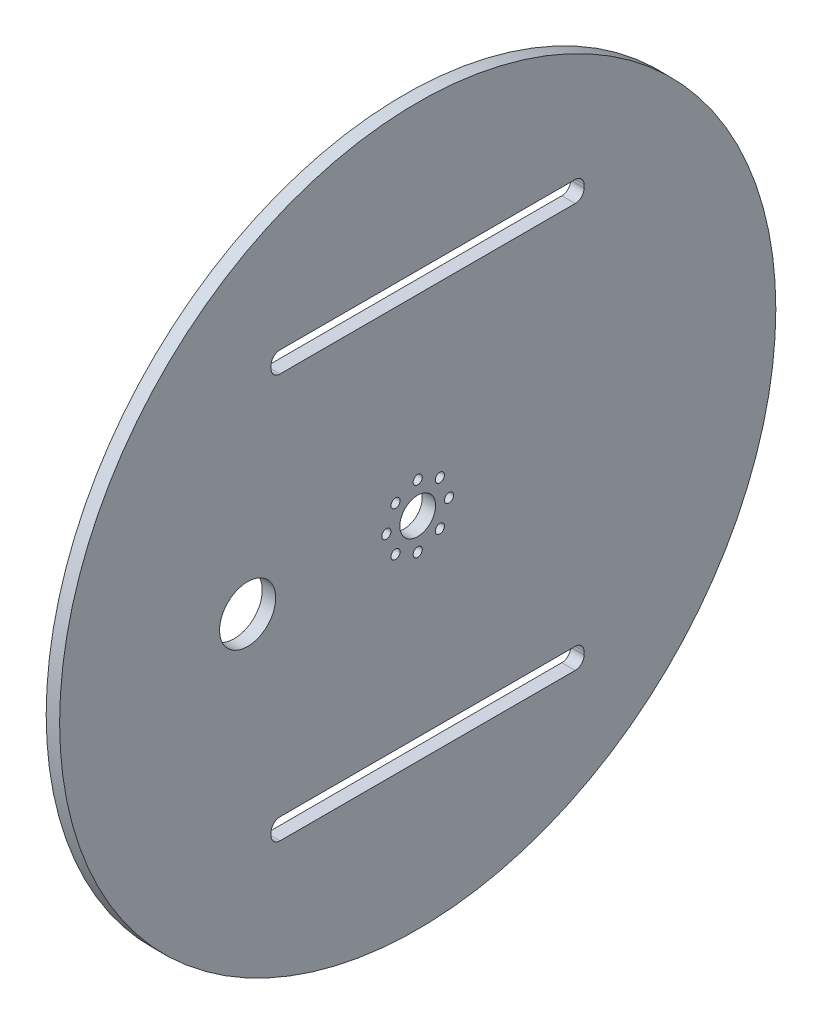
ISO-10303-21;
HEADER;
FILE_DESCRIPTION(('STEP AP214'),'2;1');
FILE_NAME('part.step','',(''),(''),'','','');
FILE_SCHEMA(('AUTOMOTIVE_DESIGN { 1 0 10303 214 1 1 1 1 }'));
ENDSEC;
DATA;
#1=APPLICATION_CONTEXT('core data for automotive mechanical design processes');
#2=APPLICATION_PROTOCOL_DEFINITION('international standard','automotive_design',2000,#1);
#3=PRODUCT_CONTEXT('',#1,'mechanical');
#4=PRODUCT('Part','Part','',(#3));
#5=PRODUCT_RELATED_PRODUCT_CATEGORY('part','',(#4));
#6=PRODUCT_DEFINITION_FORMATION('','',#4);
#7=PRODUCT_DEFINITION_CONTEXT('part definition',#1,'design');
#8=PRODUCT_DEFINITION('design','',#6,#7);
#9=PRODUCT_DEFINITION_SHAPE('','',#8);
#10=(LENGTH_UNIT() NAMED_UNIT(*) SI_UNIT(.MILLI.,.METRE.));
#11=(NAMED_UNIT(*) PLANE_ANGLE_UNIT() SI_UNIT($,.RADIAN.));
#12=(NAMED_UNIT(*) SI_UNIT($,.STERADIAN.) SOLID_ANGLE_UNIT());
#13=UNCERTAINTY_MEASURE_WITH_UNIT(LENGTH_MEASURE(1.E-05),#10,'distance_accuracy_value','');
#14=(GEOMETRIC_REPRESENTATION_CONTEXT(3) GLOBAL_UNCERTAINTY_ASSIGNED_CONTEXT((#13)) GLOBAL_UNIT_ASSIGNED_CONTEXT((#10,
#11,#12)) REPRESENTATION_CONTEXT('',''));
#15=CARTESIAN_POINT('',(0.,0.,0.));
#16=DIRECTION('',(0.,0.,1.));
#17=DIRECTION('',(1.,0.,0.));
#18=AXIS2_PLACEMENT_3D('',#15,#16,#17);
#19=CARTESIAN_POINT('',(3.,0.,0.));
#20=DIRECTION('',(1.,0.,0.));
#21=DIRECTION('',(0.,0.,-1.));
#22=AXIS2_PLACEMENT_3D('',#19,#20,#21);
#23=PLANE('',#22);
#24=CARTESIAN_POINT('',(3.,6.99999999999923,8.88178419700125E-13));
#25=DIRECTION('',(1.,0.,0.));
#26=DIRECTION('',(0.,0.,-1.));
#27=AXIS2_PLACEMENT_3D('',#24,#25,#26);
#28=CIRCLE('',#27,1.02000000000003);
#29=CARTESIAN_POINT('',(3.,6.99999999999923,-1.01999999999914));
#30=VERTEX_POINT('',#29);
#31=EDGE_CURVE('E219',#30,#30,#28,.T.);
#32=ORIENTED_EDGE('',*,*,#31,.F.);
#33=EDGE_LOOP('',(#32));
#34=FACE_BOUND('',#33,.T.);
#35=CARTESIAN_POINT('',(3.,-6.66133814775094E-13,6.99999999999923));
#36=DIRECTION('',(1.,0.,0.));
#37=DIRECTION('',(0.,0.,-1.));
#38=AXIS2_PLACEMENT_3D('',#35,#36,#37);
#39=CIRCLE('',#38,1.02000000000003);
#40=CARTESIAN_POINT('',(3.,-6.66133814775094E-13,5.9799999999992));
#41=VERTEX_POINT('',#40);
#42=EDGE_CURVE('E231',#41,#41,#39,.T.);
#43=ORIENTED_EDGE('',*,*,#42,.F.);
#44=EDGE_LOOP('',(#43));
#45=FACE_BOUND('',#44,.T.);
#46=CARTESIAN_POINT('',(3.,-6.99999999999923,-4.44089209850063E-13));
#47=DIRECTION('',(1.,0.,0.));
#48=DIRECTION('',(0.,0.,-1.));
#49=AXIS2_PLACEMENT_3D('',#46,#47,#48);
#50=CIRCLE('',#49,1.02000000000003);
#51=CARTESIAN_POINT('',(3.,-6.99999999999923,-1.02000000000047));
#52=VERTEX_POINT('',#51);
#53=EDGE_CURVE('E243',#52,#52,#50,.T.);
#54=ORIENTED_EDGE('',*,*,#53,.F.);
#55=EDGE_LOOP('',(#54));
#56=FACE_BOUND('',#55,.T.);
#57=DIRECTION('',(0.,0.,-1.));
#58=VECTOR('',#57,1.);
#59=CARTESIAN_POINT('',(3.,42.8370574368007,30.755353243443));
#60=LINE('',#59,#58);
#61=CARTESIAN_POINT('',(3.,42.8370574368007,30.755353243443));
#62=VERTEX_POINT('',#61);
#63=CARTESIAN_POINT('',(3.,42.8370574368008,-35.1750055721376));
#64=VERTEX_POINT('',#63);
#65=EDGE_CURVE('E257',#62,#64,#60,.T.);
#66=ORIENTED_EDGE('',*,*,#65,.F.);
#67=CARTESIAN_POINT('',(3.,44.8370574368007,30.7553532434435));
#68=DIRECTION('',(1.,0.,0.));
#69=DIRECTION('',(0.,0.,-1.));
#70=AXIS2_PLACEMENT_3D('',#67,#68,#69);
#71=CIRCLE('',#70,1.99999999999989);
#72=CARTESIAN_POINT('',(3.,44.8370574368007,32.7553532434433));
#73=VERTEX_POINT('',#72);
#74=EDGE_CURVE('E255',#73,#62,#71,.T.);
#75=ORIENTED_EDGE('',*,*,#74,.F.);
#76=DIRECTION('',(0.,-1.,0.));
#77=VECTOR('',#76,1.);
#78=CARTESIAN_POINT('',(3.,44.8370574368007,32.7553532434433));
#79=LINE('',#78,#77);
#80=CARTESIAN_POINT('',(3.,45.4890770146612,32.7553532434433));
#81=VERTEX_POINT('',#80);
#82=EDGE_CURVE('E271',#81,#73,#79,.T.);
#83=ORIENTED_EDGE('',*,*,#82,.F.);
#84=CARTESIAN_POINT('',(3.,45.4890770146612,30.7553532434435));
#85=DIRECTION('',(1.,0.,0.));
#86=DIRECTION('',(0.,0.,-1.));
#87=AXIS2_PLACEMENT_3D('',#84,#85,#86);
#88=CIRCLE('',#87,1.99999999999989);
#89=CARTESIAN_POINT('',(3.,47.4890770146611,30.755353243443));
#90=VERTEX_POINT('',#89);
#91=EDGE_CURVE('E268',#90,#81,#88,.T.);
#92=ORIENTED_EDGE('',*,*,#91,.F.);
#93=DIRECTION('',(0.,0.,1.));
#94=VECTOR('',#93,1.);
#95=CARTESIAN_POINT('',(3.,47.4890770146612,30.755353243443));
#96=LINE('',#95,#94);
#97=CARTESIAN_POINT('',(3.,47.4890770146612,-35.1750055721376));
#98=VERTEX_POINT('',#97);
#99=EDGE_CURVE('E266',#98,#90,#96,.T.);
#100=ORIENTED_EDGE('',*,*,#99,.F.);
#101=CARTESIAN_POINT('',(3.,45.4890770146612,-35.175005572138));
#102=DIRECTION('',(1.,0.,0.));
#103=DIRECTION('',(0.,0.,1.));
#104=AXIS2_PLACEMENT_3D('',#101,#102,#103);
#105=CIRCLE('',#104,1.99999999999989);
#106=CARTESIAN_POINT('',(3.,45.4890770146612,-37.1750055721379));
#107=VERTEX_POINT('',#106);
#108=EDGE_CURVE('E264',#107,#98,#105,.T.);
#109=ORIENTED_EDGE('',*,*,#108,.F.);
#110=DIRECTION('',(0.,1.,0.));
#111=VECTOR('',#110,1.);
#112=CARTESIAN_POINT('',(3.,45.4890770146612,-37.1750055721378));
#113=LINE('',#112,#111);
#114=CARTESIAN_POINT('',(3.,44.8370574368007,-37.1750055721378));
#115=VERTEX_POINT('',#114);
#116=EDGE_CURVE('E262',#115,#107,#113,.T.);
#117=ORIENTED_EDGE('',*,*,#116,.F.);
#118=CARTESIAN_POINT('',(3.,44.8370574368007,-35.175005572138));
#119=DIRECTION('',(1.,0.,0.));
#120=DIRECTION('',(0.,0.,1.));
#121=AXIS2_PLACEMENT_3D('',#118,#119,#120);
#122=CIRCLE('',#121,1.99999999999989);
#123=EDGE_CURVE('E260',#64,#115,#122,.T.);
#124=ORIENTED_EDGE('',*,*,#123,.F.);
#125=EDGE_LOOP('',(#66,#75,#83,#92,#100,#109,#117,#124));
#126=FACE_BOUND('',#125,.T.);
#127=CARTESIAN_POINT('',(3.,6.66133814775094E-13,-6.99999999999923));
#128=DIRECTION('',(1.,0.,0.));
#129=DIRECTION('',(0.,0.,-1.));
#130=AXIS2_PLACEMENT_3D('',#127,#128,#129);
#131=CIRCLE('',#130,1.02000000000003);
#132=CARTESIAN_POINT('',(3.,6.66133814775094E-13,-8.01999999999926));
#133=VERTEX_POINT('',#132);
#134=EDGE_CURVE('E314',#133,#133,#131,.T.);
#135=ORIENTED_EDGE('',*,*,#134,.F.);
#136=EDGE_LOOP('',(#135));
#137=FACE_BOUND('',#136,.T.);
#138=CARTESIAN_POINT('',(3.,0.,0.));
#139=DIRECTION('',(1.,0.,0.));
#140=DIRECTION('',(0.,0.,-1.));
#141=AXIS2_PLACEMENT_3D('',#138,#139,#140);
#142=CIRCLE('',#141,4.00000000000021);
#143=CARTESIAN_POINT('',(3.,0.,-4.00000000000021));
#144=VERTEX_POINT('',#143);
#145=EDGE_CURVE('E326',#144,#144,#142,.T.);
#146=ORIENTED_EDGE('',*,*,#145,.F.);
#147=EDGE_LOOP('',(#146));
#148=FACE_BOUND('',#147,.T.);
#149=CARTESIAN_POINT('',(3.,0.,0.));
#150=DIRECTION('',(1.,0.,0.));
#151=DIRECTION('',(0.,0.,-1.));
#152=AXIS2_PLACEMENT_3D('',#149,#150,#151);
#153=CIRCLE('',#152,79.9999999999999);
#154=CARTESIAN_POINT('',(3.,0.,-79.9999999999999));
#155=VERTEX_POINT('',#154);
#156=EDGE_CURVE('E11',#155,#155,#153,.T.);
#157=ORIENTED_EDGE('',*,*,#156,.T.);
#158=EDGE_LOOP('',(#157));
#159=FACE_BOUND('',#158,.T.);
#160=CARTESIAN_POINT('',(3.,4.94974746830579,-4.9497474683049));
#161=DIRECTION('',(1.,0.,0.));
#162=DIRECTION('',(0.,0.,-1.));
#163=AXIS2_PLACEMENT_3D('',#160,#161,#162);
#164=CIRCLE('',#163,1.02000000000003);
#165=CARTESIAN_POINT('',(3.,4.94974746830579,-5.96974746830493));
#166=VERTEX_POINT('',#165);
#167=EDGE_CURVE('E320',#166,#166,#164,.T.);
#168=ORIENTED_EDGE('',*,*,#167,.F.);
#169=EDGE_LOOP('',(#168));
#170=FACE_BOUND('',#169,.T.);
#171=CARTESIAN_POINT('',(3.,-4.9497474683049,-4.94974746830579));
#172=DIRECTION('',(1.,0.,0.));
#173=DIRECTION('',(0.,0.,-1.));
#174=AXIS2_PLACEMENT_3D('',#171,#172,#173);
#175=CIRCLE('',#174,1.02000000000003);
#176=CARTESIAN_POINT('',(3.,-4.9497474683049,-5.96974746830582));
#177=VERTEX_POINT('',#176);
#178=EDGE_CURVE('E249',#177,#177,#175,.T.);
#179=ORIENTED_EDGE('',*,*,#178,.F.);
#180=EDGE_LOOP('',(#179));
#181=FACE_BOUND('',#180,.T.);
#182=CARTESIAN_POINT('',(3.,-4.94974746830579,4.9497474683049));
#183=DIRECTION('',(1.,0.,0.));
#184=DIRECTION('',(0.,0.,-1.));
#185=AXIS2_PLACEMENT_3D('',#182,#183,#184);
#186=CIRCLE('',#185,1.02000000000003);
#187=CARTESIAN_POINT('',(3.,-4.94974746830579,3.92974746830487));
#188=VERTEX_POINT('',#187);
#189=EDGE_CURVE('E237',#188,#188,#186,.T.);
#190=ORIENTED_EDGE('',*,*,#189,.F.);
#191=EDGE_LOOP('',(#190));
#192=FACE_BOUND('',#191,.T.);
#193=CARTESIAN_POINT('',(3.,4.9497474683049,4.94974746830579));
#194=DIRECTION('',(1.,0.,0.));
#195=DIRECTION('',(0.,0.,-1.));
#196=AXIS2_PLACEMENT_3D('',#193,#194,#195);
#197=CIRCLE('',#196,1.02000000000003);
#198=CARTESIAN_POINT('',(3.,4.9497474683049,3.92974746830576));
#199=VERTEX_POINT('',#198);
#200=EDGE_CURVE('E225',#199,#199,#197,.T.);
#201=ORIENTED_EDGE('',*,*,#200,.F.);
#202=EDGE_LOOP('',(#201));
#203=FACE_BOUND('',#202,.T.);
#204=CARTESIAN_POINT('',(3.,0.,38.0000000000003));
#205=DIRECTION('',(1.,0.,0.));
#206=DIRECTION('',(0.,0.,-1.));
#207=AXIS2_PLACEMENT_3D('',#204,#205,#206);
#208=CIRCLE('',#207,6.26995214826618);
#209=CARTESIAN_POINT('',(3.,0.,31.7300478517341));
#210=VERTEX_POINT('',#209);
#211=EDGE_CURVE('E213',#210,#210,#208,.T.);
#212=ORIENTED_EDGE('',*,*,#211,.F.);
#213=EDGE_LOOP('',(#212));
#214=FACE_BOUND('',#213,.T.);
#215=DIRECTION('',(0.,0.,-1.));
#216=VECTOR('',#215,1.);
#217=CARTESIAN_POINT('',(3.,-47.4890770146612,30.755353243443));
#218=LINE('',#217,#216);
#219=CARTESIAN_POINT('',(3.,-47.4890770146612,30.755353243443));
#220=VERTEX_POINT('',#219);
#221=CARTESIAN_POINT('',(3.,-47.4890770146612,-35.1750055721376));
#222=VERTEX_POINT('',#221);
#223=EDGE_CURVE('E156',#220,#222,#218,.T.);
#224=ORIENTED_EDGE('',*,*,#223,.F.);
#225=CARTESIAN_POINT('',(3.,-45.4890770146612,30.7553532434435));
#226=DIRECTION('',(1.,0.,0.));
#227=DIRECTION('',(0.,0.,1.));
#228=AXIS2_PLACEMENT_3D('',#225,#226,#227);
#229=CIRCLE('',#228,1.99999999999989);
#230=CARTESIAN_POINT('',(3.,-45.4890770146612,32.7553532434433));
#231=VERTEX_POINT('',#230);
#232=EDGE_CURVE('E148',#231,#220,#229,.T.);
#233=ORIENTED_EDGE('',*,*,#232,.F.);
#234=DIRECTION('',(0.,-1.,0.));
#235=VECTOR('',#234,1.);
#236=CARTESIAN_POINT('',(3.,-44.8370574368007,32.7553532434433));
#237=LINE('',#236,#235);
#238=CARTESIAN_POINT('',(3.,-44.8370574368007,32.7553532434433));
#239=VERTEX_POINT('',#238);
#240=EDGE_CURVE('E181',#239,#231,#237,.T.);
#241=ORIENTED_EDGE('',*,*,#240,.F.);
#242=CARTESIAN_POINT('',(3.,-44.8370574368007,30.7553532434435));
#243=DIRECTION('',(1.,0.,0.));
#244=DIRECTION('',(0.,0.,1.));
#245=AXIS2_PLACEMENT_3D('',#242,#243,#244);
#246=CIRCLE('',#245,1.99999999999989);
#247=CARTESIAN_POINT('',(3.,-42.8370574368007,30.755353243443));
#248=VERTEX_POINT('',#247);
#249=EDGE_CURVE('E179',#248,#239,#246,.T.);
#250=ORIENTED_EDGE('',*,*,#249,.F.);
#251=DIRECTION('',(0.,0.,1.));
#252=VECTOR('',#251,1.);
#253=CARTESIAN_POINT('',(3.,-42.8370574368007,30.755353243443));
#254=LINE('',#253,#252);
#255=CARTESIAN_POINT('',(3.,-42.8370574368008,-35.1750055721376));
#256=VERTEX_POINT('',#255);
#257=EDGE_CURVE('E177',#256,#248,#254,.T.);
#258=ORIENTED_EDGE('',*,*,#257,.F.);
#259=CARTESIAN_POINT('',(3.,-44.8370574368007,-35.175005572138));
#260=DIRECTION('',(1.,0.,0.));
#261=DIRECTION('',(0.,0.,-1.));
#262=AXIS2_PLACEMENT_3D('',#259,#260,#261);
#263=CIRCLE('',#262,1.99999999999989);
#264=CARTESIAN_POINT('',(3.,-44.8370574368007,-37.1750055721378));
#265=VERTEX_POINT('',#264);
#266=EDGE_CURVE('E175',#265,#256,#263,.T.);
#267=ORIENTED_EDGE('',*,*,#266,.F.);
#268=DIRECTION('',(0.,1.,0.));
#269=VECTOR('',#268,1.);
#270=CARTESIAN_POINT('',(3.,-45.4890770146612,-37.1750055721378));
#271=LINE('',#270,#269);
#272=CARTESIAN_POINT('',(3.,-45.4890770146612,-37.1750055721379));
#273=VERTEX_POINT('',#272);
#274=EDGE_CURVE('E171',#273,#265,#271,.T.);
#275=ORIENTED_EDGE('',*,*,#274,.F.);
#276=CARTESIAN_POINT('',(3.,-45.4890770146612,-35.175005572138));
#277=DIRECTION('',(1.,0.,0.));
#278=DIRECTION('',(0.,0.,-1.));
#279=AXIS2_PLACEMENT_3D('',#276,#277,#278);
#280=CIRCLE('',#279,1.99999999999989);
#281=EDGE_CURVE('E169',#222,#273,#280,.T.);
#282=ORIENTED_EDGE('',*,*,#281,.F.);
#283=EDGE_LOOP('',(#224,#233,#241,#250,#258,#267,#275,#282));
#284=FACE_BOUND('',#283,.T.);
#285=ADVANCED_FACE('F35',(#34,#45,#56,#126,#137,#148,#159,#170,#181,#192,#203,#214,#284),#23,.T.);
#286=CARTESIAN_POINT('',(0.,0.,0.));
#287=DIRECTION('',(1.,0.,0.));
#288=DIRECTION('',(0.,0.,-1.));
#289=AXIS2_PLACEMENT_3D('',#286,#287,#288);
#290=PLANE('',#289);
#291=CARTESIAN_POINT('',(0.,0.,38.0000000000003));
#292=DIRECTION('',(1.,0.,0.));
#293=DIRECTION('',(0.,0.,-1.));
#294=AXIS2_PLACEMENT_3D('',#291,#292,#293);
#295=CIRCLE('',#294,6.26995214826618);
#296=CARTESIAN_POINT('',(0.,0.,31.7300478517341));
#297=VERTEX_POINT('',#296);
#298=EDGE_CURVE('E164',#297,#297,#295,.T.);
#299=ORIENTED_EDGE('',*,*,#298,.T.);
#300=EDGE_LOOP('',(#299));
#301=FACE_BOUND('',#300,.T.);
#302=CARTESIAN_POINT('',(0.,6.99999999999923,8.88178419700125E-13));
#303=DIRECTION('',(1.,0.,0.));
#304=DIRECTION('',(0.,0.,-1.));
#305=AXIS2_PLACEMENT_3D('',#302,#303,#304);
#306=CIRCLE('',#305,1.02000000000003);
#307=CARTESIAN_POINT('',(0.,6.99999999999923,-1.01999999999914));
#308=VERTEX_POINT('',#307);
#309=EDGE_CURVE('E216',#308,#308,#306,.T.);
#310=ORIENTED_EDGE('',*,*,#309,.T.);
#311=EDGE_LOOP('',(#310));
#312=FACE_BOUND('',#311,.T.);
#313=CARTESIAN_POINT('',(0.,4.9497474683049,4.94974746830579));
#314=DIRECTION('',(1.,0.,0.));
#315=DIRECTION('',(0.,0.,-1.));
#316=AXIS2_PLACEMENT_3D('',#313,#314,#315);
#317=CIRCLE('',#316,1.02000000000003);
#318=CARTESIAN_POINT('',(0.,4.9497474683049,3.92974746830576));
#319=VERTEX_POINT('',#318);
#320=EDGE_CURVE('E222',#319,#319,#317,.T.);
#321=ORIENTED_EDGE('',*,*,#320,.T.);
#322=EDGE_LOOP('',(#321));
#323=FACE_BOUND('',#322,.T.);
#324=CARTESIAN_POINT('',(0.,-6.66133814775094E-13,6.99999999999923));
#325=DIRECTION('',(1.,0.,0.));
#326=DIRECTION('',(0.,0.,-1.));
#327=AXIS2_PLACEMENT_3D('',#324,#325,#326);
#328=CIRCLE('',#327,1.02000000000003);
#329=CARTESIAN_POINT('',(0.,-6.66133814775094E-13,5.9799999999992));
#330=VERTEX_POINT('',#329);
#331=EDGE_CURVE('E228',#330,#330,#328,.T.);
#332=ORIENTED_EDGE('',*,*,#331,.T.);
#333=EDGE_LOOP('',(#332));
#334=FACE_BOUND('',#333,.T.);
#335=CARTESIAN_POINT('',(0.,-4.94974746830579,4.9497474683049));
#336=DIRECTION('',(1.,0.,0.));
#337=DIRECTION('',(0.,0.,-1.));
#338=AXIS2_PLACEMENT_3D('',#335,#336,#337);
#339=CIRCLE('',#338,1.02000000000003);
#340=CARTESIAN_POINT('',(0.,-4.94974746830579,3.92974746830487));
#341=VERTEX_POINT('',#340);
#342=EDGE_CURVE('E234',#341,#341,#339,.T.);
#343=ORIENTED_EDGE('',*,*,#342,.T.);
#344=EDGE_LOOP('',(#343));
#345=FACE_BOUND('',#344,.T.);
#346=CARTESIAN_POINT('',(0.,-6.99999999999923,-4.44089209850063E-13));
#347=DIRECTION('',(1.,0.,0.));
#348=DIRECTION('',(0.,0.,-1.));
#349=AXIS2_PLACEMENT_3D('',#346,#347,#348);
#350=CIRCLE('',#349,1.02000000000003);
#351=CARTESIAN_POINT('',(0.,-6.99999999999923,-1.02000000000047));
#352=VERTEX_POINT('',#351);
#353=EDGE_CURVE('E240',#352,#352,#350,.T.);
#354=ORIENTED_EDGE('',*,*,#353,.T.);
#355=EDGE_LOOP('',(#354));
#356=FACE_BOUND('',#355,.T.);
#357=CARTESIAN_POINT('',(0.,-4.9497474683049,-4.94974746830579));
#358=DIRECTION('',(1.,0.,0.));
#359=DIRECTION('',(0.,0.,-1.));
#360=AXIS2_PLACEMENT_3D('',#357,#358,#359);
#361=CIRCLE('',#360,1.02000000000003);
#362=CARTESIAN_POINT('',(0.,-4.9497474683049,-5.96974746830582));
#363=VERTEX_POINT('',#362);
#364=EDGE_CURVE('E246',#363,#363,#361,.T.);
#365=ORIENTED_EDGE('',*,*,#364,.T.);
#366=EDGE_LOOP('',(#365));
#367=FACE_BOUND('',#366,.T.);
#368=CARTESIAN_POINT('',(0.,44.8370574368007,30.7553532434435));
#369=DIRECTION('',(1.,0.,0.));
#370=DIRECTION('',(0.,0.,-1.));
#371=AXIS2_PLACEMENT_3D('',#368,#369,#370);
#372=CIRCLE('',#371,1.99999999999989);
#373=CARTESIAN_POINT('',(0.,44.8370574368007,32.7553532434433));
#374=VERTEX_POINT('',#373);
#375=CARTESIAN_POINT('',(0.,42.8370574368007,30.755353243443));
#376=VERTEX_POINT('',#375);
#377=EDGE_CURVE('E252',#374,#376,#372,.T.);
#378=ORIENTED_EDGE('',*,*,#377,.T.);
#379=DIRECTION('',(0.,0.,-1.));
#380=VECTOR('',#379,1.);
#381=CARTESIAN_POINT('',(0.,42.8370574368007,30.755353243443));
#382=LINE('',#381,#380);
#383=CARTESIAN_POINT('',(0.,42.8370574368008,-35.1750055721376));
#384=VERTEX_POINT('',#383);
#385=EDGE_CURVE('E276',#376,#384,#382,.T.);
#386=ORIENTED_EDGE('',*,*,#385,.T.);
#387=CARTESIAN_POINT('',(0.,44.8370574368007,-35.175005572138));
#388=DIRECTION('',(1.,0.,0.));
#389=DIRECTION('',(0.,0.,1.));
#390=AXIS2_PLACEMENT_3D('',#387,#388,#389);
#391=CIRCLE('',#390,1.99999999999989);
#392=CARTESIAN_POINT('',(0.,44.8370574368007,-37.1750055721378));
#393=VERTEX_POINT('',#392);
#394=EDGE_CURVE('E279',#384,#393,#391,.T.);
#395=ORIENTED_EDGE('',*,*,#394,.T.);
#396=DIRECTION('',(0.,1.,0.));
#397=VECTOR('',#396,1.);
#398=CARTESIAN_POINT('',(0.,45.4890770146612,-37.1750055721378));
#399=LINE('',#398,#397);
#400=CARTESIAN_POINT('',(0.,45.4890770146612,-37.1750055721379));
#401=VERTEX_POINT('',#400);
#402=EDGE_CURVE('E282',#393,#401,#399,.T.);
#403=ORIENTED_EDGE('',*,*,#402,.T.);
#404=CARTESIAN_POINT('',(0.,45.4890770146612,-35.175005572138));
#405=DIRECTION('',(1.,0.,0.));
#406=DIRECTION('',(0.,0.,1.));
#407=AXIS2_PLACEMENT_3D('',#404,#405,#406);
#408=CIRCLE('',#407,1.99999999999989);
#409=CARTESIAN_POINT('',(0.,47.4890770146612,-35.1750055721376));
#410=VERTEX_POINT('',#409);
#411=EDGE_CURVE('E285',#401,#410,#408,.T.);
#412=ORIENTED_EDGE('',*,*,#411,.T.);
#413=DIRECTION('',(0.,0.,1.));
#414=VECTOR('',#413,1.);
#415=CARTESIAN_POINT('',(0.,47.4890770146612,30.755353243443));
#416=LINE('',#415,#414);
#417=CARTESIAN_POINT('',(0.,47.4890770146611,30.755353243443));
#418=VERTEX_POINT('',#417);
#419=EDGE_CURVE('E288',#410,#418,#416,.T.);
#420=ORIENTED_EDGE('',*,*,#419,.T.);
#421=CARTESIAN_POINT('',(0.,45.4890770146612,30.7553532434435));
#422=DIRECTION('',(1.,0.,0.));
#423=DIRECTION('',(0.,0.,-1.));
#424=AXIS2_PLACEMENT_3D('',#421,#422,#423);
#425=CIRCLE('',#424,1.99999999999989);
#426=CARTESIAN_POINT('',(0.,45.4890770146612,32.7553532434433));
#427=VERTEX_POINT('',#426);
#428=EDGE_CURVE('E291',#418,#427,#425,.T.);
#429=ORIENTED_EDGE('',*,*,#428,.T.);
#430=DIRECTION('',(0.,-1.,0.));
#431=VECTOR('',#430,1.);
#432=CARTESIAN_POINT('',(0.,44.8370574368007,32.7553532434433));
#433=LINE('',#432,#431);
#434=EDGE_CURVE('E258',#427,#374,#433,.T.);
#435=ORIENTED_EDGE('',*,*,#434,.T.);
#436=EDGE_LOOP('',(#378,#386,#395,#403,#412,#420,#429,#435));
#437=FACE_BOUND('',#436,.T.);
#438=CARTESIAN_POINT('',(0.,0.,0.));
#439=DIRECTION('',(1.,0.,0.));
#440=DIRECTION('',(0.,0.,-1.));
#441=AXIS2_PLACEMENT_3D('',#438,#439,#440);
#442=CIRCLE('',#441,79.9999999999999);
#443=CARTESIAN_POINT('',(0.,0.,-79.9999999999999));
#444=VERTEX_POINT('',#443);
#445=EDGE_CURVE('E39',#444,#444,#442,.T.);
#446=ORIENTED_EDGE('',*,*,#445,.F.);
#447=EDGE_LOOP('',(#446));
#448=FACE_BOUND('',#447,.T.);
#449=CARTESIAN_POINT('',(0.,0.,0.));
#450=DIRECTION('',(1.,0.,0.));
#451=DIRECTION('',(0.,0.,-1.));
#452=AXIS2_PLACEMENT_3D('',#449,#450,#451);
#453=CIRCLE('',#452,4.00000000000021);
#454=CARTESIAN_POINT('',(0.,0.,-4.00000000000021));
#455=VERTEX_POINT('',#454);
#456=EDGE_CURVE('E323',#455,#455,#453,.T.);
#457=ORIENTED_EDGE('',*,*,#456,.T.);
#458=EDGE_LOOP('',(#457));
#459=FACE_BOUND('',#458,.T.);
#460=CARTESIAN_POINT('',(0.,4.94974746830579,-4.9497474683049));
#461=DIRECTION('',(1.,0.,0.));
#462=DIRECTION('',(0.,0.,-1.));
#463=AXIS2_PLACEMENT_3D('',#460,#461,#462);
#464=CIRCLE('',#463,1.02000000000003);
#465=CARTESIAN_POINT('',(0.,4.94974746830579,-5.96974746830493));
#466=VERTEX_POINT('',#465);
#467=EDGE_CURVE('E317',#466,#466,#464,.T.);
#468=ORIENTED_EDGE('',*,*,#467,.T.);
#469=EDGE_LOOP('',(#468));
#470=FACE_BOUND('',#469,.T.);
#471=CARTESIAN_POINT('',(0.,6.66133814775094E-13,-6.99999999999923));
#472=DIRECTION('',(1.,0.,0.));
#473=DIRECTION('',(0.,0.,-1.));
#474=AXIS2_PLACEMENT_3D('',#471,#472,#473);
#475=CIRCLE('',#474,1.02000000000003);
#476=CARTESIAN_POINT('',(0.,6.66133814775094E-13,-8.01999999999926));
#477=VERTEX_POINT('',#476);
#478=EDGE_CURVE('E313',#477,#477,#475,.T.);
#479=ORIENTED_EDGE('',*,*,#478,.T.);
#480=EDGE_LOOP('',(#479));
#481=FACE_BOUND('',#480,.T.);
#482=CARTESIAN_POINT('',(0.,-45.4890770146612,30.7553532434435));
#483=DIRECTION('',(1.,0.,0.));
#484=DIRECTION('',(0.,0.,1.));
#485=AXIS2_PLACEMENT_3D('',#482,#483,#484);
#486=CIRCLE('',#485,1.99999999999989);
#487=CARTESIAN_POINT('',(0.,-45.4890770146612,32.7553532434433));
#488=VERTEX_POINT('',#487);
#489=CARTESIAN_POINT('',(0.,-47.4890770146612,30.755353243443));
#490=VERTEX_POINT('',#489);
#491=EDGE_CURVE('E58',#488,#490,#486,.T.);
#492=ORIENTED_EDGE('',*,*,#491,.T.);
#493=DIRECTION('',(0.,0.,-1.));
#494=VECTOR('',#493,1.);
#495=CARTESIAN_POINT('',(0.,-47.4890770146612,30.755353243443));
#496=LINE('',#495,#494);
#497=CARTESIAN_POINT('',(0.,-47.4890770146612,-35.1750055721376));
#498=VERTEX_POINT('',#497);
#499=EDGE_CURVE('E163',#490,#498,#496,.T.);
#500=ORIENTED_EDGE('',*,*,#499,.T.);
#501=CARTESIAN_POINT('',(0.,-45.4890770146612,-35.175005572138));
#502=DIRECTION('',(1.,0.,0.));
#503=DIRECTION('',(0.,0.,-1.));
#504=AXIS2_PLACEMENT_3D('',#501,#502,#503);
#505=CIRCLE('',#504,1.99999999999989);
#506=CARTESIAN_POINT('',(0.,-45.4890770146612,-37.1750055721379));
#507=VERTEX_POINT('',#506);
#508=EDGE_CURVE('E185',#498,#507,#505,.T.);
#509=ORIENTED_EDGE('',*,*,#508,.T.);
#510=DIRECTION('',(0.,1.,0.));
#511=VECTOR('',#510,1.);
#512=CARTESIAN_POINT('',(0.,-45.4890770146612,-37.1750055721378));
#513=LINE('',#512,#511);
#514=CARTESIAN_POINT('',(0.,-44.8370574368007,-37.1750055721378));
#515=VERTEX_POINT('',#514);
#516=EDGE_CURVE('E188',#507,#515,#513,.T.);
#517=ORIENTED_EDGE('',*,*,#516,.T.);
#518=CARTESIAN_POINT('',(0.,-44.8370574368007,-35.175005572138));
#519=DIRECTION('',(1.,0.,0.));
#520=DIRECTION('',(0.,0.,-1.));
#521=AXIS2_PLACEMENT_3D('',#518,#519,#520);
#522=CIRCLE('',#521,1.99999999999989);
#523=CARTESIAN_POINT('',(0.,-42.8370574368008,-35.1750055721376));
#524=VERTEX_POINT('',#523);
#525=EDGE_CURVE('E191',#515,#524,#522,.T.);
#526=ORIENTED_EDGE('',*,*,#525,.T.);
#527=DIRECTION('',(0.,0.,1.));
#528=VECTOR('',#527,1.);
#529=CARTESIAN_POINT('',(0.,-42.8370574368007,30.755353243443));
#530=LINE('',#529,#528);
#531=CARTESIAN_POINT('',(0.,-42.8370574368007,30.755353243443));
#532=VERTEX_POINT('',#531);
#533=EDGE_CURVE('E194',#524,#532,#530,.T.);
#534=ORIENTED_EDGE('',*,*,#533,.T.);
#535=CARTESIAN_POINT('',(0.,-44.8370574368007,30.7553532434435));
#536=DIRECTION('',(1.,0.,0.));
#537=DIRECTION('',(0.,0.,1.));
#538=AXIS2_PLACEMENT_3D('',#535,#536,#537);
#539=CIRCLE('',#538,1.99999999999989);
#540=CARTESIAN_POINT('',(0.,-44.8370574368007,32.7553532434434));
#541=VERTEX_POINT('',#540);
#542=EDGE_CURVE('E197',#532,#541,#539,.T.);
#543=ORIENTED_EDGE('',*,*,#542,.T.);
#544=DIRECTION('',(0.,-1.,0.));
#545=VECTOR('',#544,1.);
#546=CARTESIAN_POINT('',(0.,-44.8370574368007,32.7553532434433));
#547=LINE('',#546,#545);
#548=EDGE_CURVE('E157',#541,#488,#547,.T.);
#549=ORIENTED_EDGE('',*,*,#548,.T.);
#550=EDGE_LOOP('',(#492,#500,#509,#517,#526,#534,#543,#549));
#551=FACE_BOUND('',#550,.T.);
#552=ADVANCED_FACE('F332',(#301,#312,#323,#334,#345,#356,#367,#437,#448,#459,#470,#481,#551),
#290,.F.);
#553=CARTESIAN_POINT('',(3.,0.,0.));
#554=DIRECTION('',(-1.,0.,0.));
#555=DIRECTION('',(0.,0.,1.));
#556=AXIS2_PLACEMENT_3D('',#553,#554,#555);
#557=CYLINDRICAL_SURFACE('',#556,79.9999999999999);
#558=ORIENTED_EDGE('',*,*,#156,.F.);
#559=EDGE_LOOP('',(#558));
#560=FACE_BOUND('',#559,.T.);
#561=ORIENTED_EDGE('',*,*,#445,.T.);
#562=EDGE_LOOP('',(#561));
#563=FACE_BOUND('',#562,.T.);
#564=ADVANCED_FACE('F37',(#560,#563),#557,.T.);
#565=CARTESIAN_POINT('',(3.,0.,0.));
#566=DIRECTION('',(-1.,0.,0.));
#567=DIRECTION('',(0.,0.,1.));
#568=AXIS2_PLACEMENT_3D('',#565,#566,#567);
#569=CYLINDRICAL_SURFACE('',#568,4.00000000000021);
#570=ORIENTED_EDGE('',*,*,#145,.T.);
#571=EDGE_LOOP('',(#570));
#572=FACE_BOUND('',#571,.T.);
#573=ORIENTED_EDGE('',*,*,#456,.F.);
#574=EDGE_LOOP('',(#573));
#575=FACE_BOUND('',#574,.T.);
#576=ADVANCED_FACE('F335',(#572,#575),#569,.F.);
#577=CARTESIAN_POINT('',(3.,4.94974746830579,-4.9497474683049));
#578=DIRECTION('',(-1.,0.,0.));
#579=DIRECTION('',(0.,0.,1.));
#580=AXIS2_PLACEMENT_3D('',#577,#578,#579);
#581=CYLINDRICAL_SURFACE('',#580,1.02000000000003);
#582=ORIENTED_EDGE('',*,*,#167,.T.);
#583=EDGE_LOOP('',(#582));
#584=FACE_BOUND('',#583,.T.);
#585=ORIENTED_EDGE('',*,*,#467,.F.);
#586=EDGE_LOOP('',(#585));
#587=FACE_BOUND('',#586,.T.);
#588=ADVANCED_FACE('F337',(#584,#587),#581,.F.);
#589=CARTESIAN_POINT('',(3.,6.66133814775094E-13,-6.99999999999923));
#590=DIRECTION('',(-1.,0.,0.));
#591=DIRECTION('',(0.,0.,1.));
#592=AXIS2_PLACEMENT_3D('',#589,#590,#591);
#593=CYLINDRICAL_SURFACE('',#592,1.02000000000003);
#594=ORIENTED_EDGE('',*,*,#134,.T.);
#595=EDGE_LOOP('',(#594));
#596=FACE_BOUND('',#595,.T.);
#597=ORIENTED_EDGE('',*,*,#478,.F.);
#598=EDGE_LOOP('',(#597));
#599=FACE_BOUND('',#598,.T.);
#600=ADVANCED_FACE('F344',(#596,#599),#593,.F.);
#601=CARTESIAN_POINT('',(3.,44.8370574368007,30.7553532434435));
#602=DIRECTION('',(-1.,0.,0.));
#603=DIRECTION('',(0.,0.,1.));
#604=AXIS2_PLACEMENT_3D('',#601,#602,#603);
#605=CYLINDRICAL_SURFACE('',#604,1.99999999999989);
#606=ORIENTED_EDGE('',*,*,#377,.F.);
#607=DIRECTION('',(-1.,0.,0.));
#608=VECTOR('',#607,1.);
#609=CARTESIAN_POINT('',(3.,44.8370574368007,32.7553532434433));
#610=LINE('',#609,#608);
#611=EDGE_CURVE('E273',#73,#374,#610,.T.);
#612=ORIENTED_EDGE('',*,*,#611,.F.);
#613=ORIENTED_EDGE('',*,*,#74,.T.);
#614=DIRECTION('',(-1.,0.,0.));
#615=VECTOR('',#614,1.);
#616=CARTESIAN_POINT('',(3.,42.8370574368007,30.755353243443));
#617=LINE('',#616,#615);
#618=EDGE_CURVE('E310',#62,#376,#617,.T.);
#619=ORIENTED_EDGE('',*,*,#618,.T.);
#620=EDGE_LOOP('',(#606,#612,#613,#619));
#621=FACE_BOUND('',#620,.T.);
#622=ADVANCED_FACE('F407',(#621),#605,.F.);
#623=CARTESIAN_POINT('',(3.,42.8370574368007,30.755353243443));
#624=DIRECTION('',(0.,1.,0.));
#625=DIRECTION('',(0.,0.,1.));
#626=AXIS2_PLACEMENT_3D('',#623,#624,#625);
#627=PLANE('',#626);
#628=ORIENTED_EDGE('',*,*,#385,.F.);
#629=ORIENTED_EDGE('',*,*,#618,.F.);
#630=ORIENTED_EDGE('',*,*,#65,.T.);
#631=DIRECTION('',(-1.,0.,0.));
#632=VECTOR('',#631,1.);
#633=CARTESIAN_POINT('',(3.,42.8370574368008,-35.1750055721376));
#634=LINE('',#633,#632);
#635=EDGE_CURVE('E308',#64,#384,#634,.T.);
#636=ORIENTED_EDGE('',*,*,#635,.T.);
#637=EDGE_LOOP('',(#628,#629,#630,#636));
#638=FACE_BOUND('',#637,.T.);
#639=ADVANCED_FACE('F415',(#638),#627,.T.);
#640=CARTESIAN_POINT('',(3.,44.8370574368007,-35.175005572138));
#641=DIRECTION('',(-1.,0.,0.));
#642=DIRECTION('',(0.,0.,1.));
#643=AXIS2_PLACEMENT_3D('',#640,#641,#642);
#644=CYLINDRICAL_SURFACE('',#643,1.99999999999989);
#645=ORIENTED_EDGE('',*,*,#394,.F.);
#646=ORIENTED_EDGE('',*,*,#635,.F.);
#647=ORIENTED_EDGE('',*,*,#123,.T.);
#648=DIRECTION('',(-1.,0.,0.));
#649=VECTOR('',#648,1.);
#650=CARTESIAN_POINT('',(3.,44.8370574368007,-37.1750055721378));
#651=LINE('',#650,#649);
#652=EDGE_CURVE('E306',#115,#393,#651,.T.);
#653=ORIENTED_EDGE('',*,*,#652,.T.);
#654=EDGE_LOOP('',(#645,#646,#647,#653));
#655=FACE_BOUND('',#654,.T.);
#656=ADVANCED_FACE('F419',(#655),#644,.F.);
#657=CARTESIAN_POINT('',(3.,45.4890770146612,-37.1750055721378));
#658=DIRECTION('',(0.,0.,1.));
#659=DIRECTION('',(1.,0.,0.));
#660=AXIS2_PLACEMENT_3D('',#657,#658,#659);
#661=PLANE('',#660);
#662=ORIENTED_EDGE('',*,*,#402,.F.);
#663=ORIENTED_EDGE('',*,*,#652,.F.);
#664=ORIENTED_EDGE('',*,*,#116,.T.);
#665=DIRECTION('',(-1.,0.,0.));
#666=VECTOR('',#665,1.);
#667=CARTESIAN_POINT('',(3.,45.4890770146612,-37.1750055721379));
#668=LINE('',#667,#666);
#669=EDGE_CURVE('E304',#107,#401,#668,.T.);
#670=ORIENTED_EDGE('',*,*,#669,.T.);
#671=EDGE_LOOP('',(#662,#663,#664,#670));
#672=FACE_BOUND('',#671,.T.);
#673=ADVANCED_FACE('F424',(#672),#661,.T.);
#674=CARTESIAN_POINT('',(3.,45.4890770146612,-35.175005572138));
#675=DIRECTION('',(-1.,0.,0.));
#676=DIRECTION('',(0.,0.,1.));
#677=AXIS2_PLACEMENT_3D('',#674,#675,#676);
#678=CYLINDRICAL_SURFACE('',#677,1.99999999999989);
#679=ORIENTED_EDGE('',*,*,#411,.F.);
#680=ORIENTED_EDGE('',*,*,#669,.F.);
#681=ORIENTED_EDGE('',*,*,#108,.T.);
#682=DIRECTION('',(-1.,0.,0.));
#683=VECTOR('',#682,1.);
#684=CARTESIAN_POINT('',(3.,47.4890770146612,-35.1750055721376));
#685=LINE('',#684,#683);
#686=EDGE_CURVE('E302',#98,#410,#685,.T.);
#687=ORIENTED_EDGE('',*,*,#686,.T.);
#688=EDGE_LOOP('',(#679,#680,#681,#687));
#689=FACE_BOUND('',#688,.T.);
#690=ADVANCED_FACE('F429',(#689),#678,.F.);
#691=CARTESIAN_POINT('',(3.,47.4890770146612,30.755353243443));
#692=DIRECTION('',(0.,-1.,0.));
#693=DIRECTION('',(0.,0.,-1.));
#694=AXIS2_PLACEMENT_3D('',#691,#692,#693);
#695=PLANE('',#694);
#696=ORIENTED_EDGE('',*,*,#419,.F.);
#697=ORIENTED_EDGE('',*,*,#686,.F.);
#698=ORIENTED_EDGE('',*,*,#99,.T.);
#699=DIRECTION('',(-1.,0.,0.));
#700=VECTOR('',#699,1.);
#701=CARTESIAN_POINT('',(3.,47.4890770146611,30.755353243443));
#702=LINE('',#701,#700);
#703=EDGE_CURVE('E300',#90,#418,#702,.T.);
#704=ORIENTED_EDGE('',*,*,#703,.T.);
#705=EDGE_LOOP('',(#696,#697,#698,#704));
#706=FACE_BOUND('',#705,.T.);
#707=ADVANCED_FACE('F433',(#706),#695,.T.);
#708=CARTESIAN_POINT('',(3.,45.4890770146612,30.7553532434435));
#709=DIRECTION('',(-1.,0.,0.));
#710=DIRECTION('',(0.,0.,1.));
#711=AXIS2_PLACEMENT_3D('',#708,#709,#710);
#712=CYLINDRICAL_SURFACE('',#711,1.99999999999989);
#713=ORIENTED_EDGE('',*,*,#428,.F.);
#714=ORIENTED_EDGE('',*,*,#703,.F.);
#715=ORIENTED_EDGE('',*,*,#91,.T.);
#716=DIRECTION('',(-1.,0.,0.));
#717=VECTOR('',#716,1.);
#718=CARTESIAN_POINT('',(3.,45.4890770146612,32.7553532434433));
#719=LINE('',#718,#717);
#720=EDGE_CURVE('E298',#81,#427,#719,.T.);
#721=ORIENTED_EDGE('',*,*,#720,.T.);
#722=EDGE_LOOP('',(#713,#714,#715,#721));
#723=FACE_BOUND('',#722,.T.);
#724=ADVANCED_FACE('F437',(#723),#712,.F.);
#725=CARTESIAN_POINT('',(3.,44.8370574368007,32.7553532434433));
#726=DIRECTION('',(0.,0.,-1.));
#727=DIRECTION('',(-1.,0.,0.));
#728=AXIS2_PLACEMENT_3D('',#725,#726,#727);
#729=PLANE('',#728);
#730=ORIENTED_EDGE('',*,*,#434,.F.);
#731=ORIENTED_EDGE('',*,*,#720,.F.);
#732=ORIENTED_EDGE('',*,*,#82,.T.);
#733=ORIENTED_EDGE('',*,*,#611,.T.);
#734=EDGE_LOOP('',(#730,#731,#732,#733));
#735=FACE_BOUND('',#734,.T.);
#736=ADVANCED_FACE('F410',(#735),#729,.T.);
#737=CARTESIAN_POINT('',(3.,-4.9497474683049,-4.94974746830579));
#738=DIRECTION('',(-1.,0.,0.));
#739=DIRECTION('',(0.,0.,1.));
#740=AXIS2_PLACEMENT_3D('',#737,#738,#739);
#741=CYLINDRICAL_SURFACE('',#740,1.02000000000003);
#742=ORIENTED_EDGE('',*,*,#178,.T.);
#743=EDGE_LOOP('',(#742));
#744=FACE_BOUND('',#743,.T.);
#745=ORIENTED_EDGE('',*,*,#364,.F.);
#746=EDGE_LOOP('',(#745));
#747=FACE_BOUND('',#746,.T.);
#748=ADVANCED_FACE('F444',(#744,#747),#741,.F.);
#749=CARTESIAN_POINT('',(3.,-6.99999999999923,-4.44089209850063E-13));
#750=DIRECTION('',(-1.,0.,0.));
#751=DIRECTION('',(0.,0.,1.));
#752=AXIS2_PLACEMENT_3D('',#749,#750,#751);
#753=CYLINDRICAL_SURFACE('',#752,1.02000000000003);
#754=ORIENTED_EDGE('',*,*,#53,.T.);
#755=EDGE_LOOP('',(#754));
#756=FACE_BOUND('',#755,.T.);
#757=ORIENTED_EDGE('',*,*,#353,.F.);
#758=EDGE_LOOP('',(#757));
#759=FACE_BOUND('',#758,.T.);
#760=ADVANCED_FACE('F516',(#756,#759),#753,.F.);
#761=CARTESIAN_POINT('',(3.,-4.94974746830579,4.9497474683049));
#762=DIRECTION('',(-1.,0.,0.));
#763=DIRECTION('',(0.,0.,1.));
#764=AXIS2_PLACEMENT_3D('',#761,#762,#763);
#765=CYLINDRICAL_SURFACE('',#764,1.02000000000003);
#766=ORIENTED_EDGE('',*,*,#189,.T.);
#767=EDGE_LOOP('',(#766));
#768=FACE_BOUND('',#767,.T.);
#769=ORIENTED_EDGE('',*,*,#342,.F.);
#770=EDGE_LOOP('',(#769));
#771=FACE_BOUND('',#770,.T.);
#772=ADVANCED_FACE('F512',(#768,#771),#765,.F.);
#773=CARTESIAN_POINT('',(3.,-6.66133814775094E-13,6.99999999999923));
#774=DIRECTION('',(-1.,0.,0.));
#775=DIRECTION('',(0.,0.,1.));
#776=AXIS2_PLACEMENT_3D('',#773,#774,#775);
#777=CYLINDRICAL_SURFACE('',#776,1.02000000000003);
#778=ORIENTED_EDGE('',*,*,#42,.T.);
#779=EDGE_LOOP('',(#778));
#780=FACE_BOUND('',#779,.T.);
#781=ORIENTED_EDGE('',*,*,#331,.F.);
#782=EDGE_LOOP('',(#781));
#783=FACE_BOUND('',#782,.T.);
#784=ADVANCED_FACE('F508',(#780,#783),#777,.F.);
#785=CARTESIAN_POINT('',(3.,4.9497474683049,4.94974746830579));
#786=DIRECTION('',(-1.,0.,0.));
#787=DIRECTION('',(0.,0.,1.));
#788=AXIS2_PLACEMENT_3D('',#785,#786,#787);
#789=CYLINDRICAL_SURFACE('',#788,1.02000000000003);
#790=ORIENTED_EDGE('',*,*,#200,.T.);
#791=EDGE_LOOP('',(#790));
#792=FACE_BOUND('',#791,.T.);
#793=ORIENTED_EDGE('',*,*,#320,.F.);
#794=EDGE_LOOP('',(#793));
#795=FACE_BOUND('',#794,.T.);
#796=ADVANCED_FACE('F504',(#792,#795),#789,.F.);
#797=CARTESIAN_POINT('',(3.,6.99999999999923,8.88178419700125E-13));
#798=DIRECTION('',(-1.,0.,0.));
#799=DIRECTION('',(0.,0.,1.));
#800=AXIS2_PLACEMENT_3D('',#797,#798,#799);
#801=CYLINDRICAL_SURFACE('',#800,1.02000000000003);
#802=ORIENTED_EDGE('',*,*,#31,.T.);
#803=EDGE_LOOP('',(#802));
#804=FACE_BOUND('',#803,.T.);
#805=ORIENTED_EDGE('',*,*,#309,.F.);
#806=EDGE_LOOP('',(#805));
#807=FACE_BOUND('',#806,.T.);
#808=ADVANCED_FACE('F384',(#804,#807),#801,.F.);
#809=CARTESIAN_POINT('',(3.,0.,38.0000000000003));
#810=DIRECTION('',(-1.,0.,0.));
#811=DIRECTION('',(0.,0.,1.));
#812=AXIS2_PLACEMENT_3D('',#809,#810,#811);
#813=CYLINDRICAL_SURFACE('',#812,6.26995214826618);
#814=ORIENTED_EDGE('',*,*,#211,.T.);
#815=EDGE_LOOP('',(#814));
#816=FACE_BOUND('',#815,.T.);
#817=ORIENTED_EDGE('',*,*,#298,.F.);
#818=EDGE_LOOP('',(#817));
#819=FACE_BOUND('',#818,.T.);
#820=ADVANCED_FACE('F381',(#816,#819),#813,.F.);
#821=CARTESIAN_POINT('',(3.,-45.4890770146612,30.7553532434435));
#822=DIRECTION('',(-1.,0.,0.));
#823=DIRECTION('',(0.,0.,1.));
#824=AXIS2_PLACEMENT_3D('',#821,#822,#823);
#825=CYLINDRICAL_SURFACE('',#824,1.99999999999989);
#826=ORIENTED_EDGE('',*,*,#491,.F.);
#827=DIRECTION('',(-1.,0.,0.));
#828=VECTOR('',#827,1.);
#829=CARTESIAN_POINT('',(3.,-45.4890770146612,32.7553532434433));
#830=LINE('',#829,#828);
#831=EDGE_CURVE('E152',#231,#488,#830,.T.);
#832=ORIENTED_EDGE('',*,*,#831,.F.);
#833=ORIENTED_EDGE('',*,*,#232,.T.);
#834=DIRECTION('',(-1.,0.,0.));
#835=VECTOR('',#834,1.);
#836=CARTESIAN_POINT('',(3.,-47.4890770146612,30.755353243443));
#837=LINE('',#836,#835);
#838=EDGE_CURVE('E151',#220,#490,#837,.T.);
#839=ORIENTED_EDGE('',*,*,#838,.T.);
#840=EDGE_LOOP('',(#826,#832,#833,#839));
#841=FACE_BOUND('',#840,.T.);
#842=ADVANCED_FACE('F150',(#841),#825,.F.);
#843=CARTESIAN_POINT('',(3.,-47.4890770146612,30.755353243443));
#844=DIRECTION('',(0.,1.,0.));
#845=DIRECTION('',(0.,0.,1.));
#846=AXIS2_PLACEMENT_3D('',#843,#844,#845);
#847=PLANE('',#846);
#848=ORIENTED_EDGE('',*,*,#499,.F.);
#849=ORIENTED_EDGE('',*,*,#838,.F.);
#850=ORIENTED_EDGE('',*,*,#223,.T.);
#851=DIRECTION('',(-1.,0.,0.));
#852=VECTOR('',#851,1.);
#853=CARTESIAN_POINT('',(3.,-47.4890770146612,-35.1750055721376));
#854=LINE('',#853,#852);
#855=EDGE_CURVE('E165',#222,#498,#854,.T.);
#856=ORIENTED_EDGE('',*,*,#855,.T.);
#857=EDGE_LOOP('',(#848,#849,#850,#856));
#858=FACE_BOUND('',#857,.T.);
#859=ADVANCED_FACE('F160',(#858),#847,.T.);
#860=CARTESIAN_POINT('',(3.,-45.4890770146612,-35.175005572138));
#861=DIRECTION('',(-1.,0.,0.));
#862=DIRECTION('',(0.,0.,1.));
#863=AXIS2_PLACEMENT_3D('',#860,#861,#862);
#864=CYLINDRICAL_SURFACE('',#863,1.99999999999989);
#865=ORIENTED_EDGE('',*,*,#508,.F.);
#866=ORIENTED_EDGE('',*,*,#855,.F.);
#867=ORIENTED_EDGE('',*,*,#281,.T.);
#868=DIRECTION('',(-1.,0.,0.));
#869=VECTOR('',#868,1.);
#870=CARTESIAN_POINT('',(3.,-45.4890770146612,-37.1750055721379));
#871=LINE('',#870,#869);
#872=EDGE_CURVE('E210',#273,#507,#871,.T.);
#873=ORIENTED_EDGE('',*,*,#872,.T.);
#874=EDGE_LOOP('',(#865,#866,#867,#873));
#875=FACE_BOUND('',#874,.T.);
#876=ADVANCED_FACE('F489',(#875),#864,.F.);
#877=CARTESIAN_POINT('',(3.,-45.4890770146612,-37.1750055721378));
#878=DIRECTION('',(0.,0.,1.));
#879=DIRECTION('',(1.,0.,0.));
#880=AXIS2_PLACEMENT_3D('',#877,#878,#879);
#881=PLANE('',#880);
#882=ORIENTED_EDGE('',*,*,#516,.F.);
#883=ORIENTED_EDGE('',*,*,#872,.F.);
#884=ORIENTED_EDGE('',*,*,#274,.T.);
#885=DIRECTION('',(-1.,0.,0.));
#886=VECTOR('',#885,1.);
#887=CARTESIAN_POINT('',(3.,-44.8370574368007,-37.1750055721378));
#888=LINE('',#887,#886);
#889=EDGE_CURVE('E208',#265,#515,#888,.T.);
#890=ORIENTED_EDGE('',*,*,#889,.T.);
#891=EDGE_LOOP('',(#882,#883,#884,#890));
#892=FACE_BOUND('',#891,.T.);
#893=ADVANCED_FACE('F486',(#892),#881,.T.);
#894=CARTESIAN_POINT('',(3.,-44.8370574368007,-35.175005572138));
#895=DIRECTION('',(-1.,0.,0.));
#896=DIRECTION('',(0.,0.,1.));
#897=AXIS2_PLACEMENT_3D('',#894,#895,#896);
#898=CYLINDRICAL_SURFACE('',#897,1.99999999999989);
#899=ORIENTED_EDGE('',*,*,#525,.F.);
#900=ORIENTED_EDGE('',*,*,#889,.F.);
#901=ORIENTED_EDGE('',*,*,#266,.T.);
#902=DIRECTION('',(-1.,0.,0.));
#903=VECTOR('',#902,1.);
#904=CARTESIAN_POINT('',(3.,-42.8370574368008,-35.1750055721376));
#905=LINE('',#904,#903);
#906=EDGE_CURVE('E206',#256,#524,#905,.T.);
#907=ORIENTED_EDGE('',*,*,#906,.T.);
#908=EDGE_LOOP('',(#899,#900,#901,#907));
#909=FACE_BOUND('',#908,.T.);
#910=ADVANCED_FACE('F481',(#909),#898,.F.);
#911=CARTESIAN_POINT('',(3.,-42.8370574368007,30.755353243443));
#912=DIRECTION('',(0.,-1.,0.));
#913=DIRECTION('',(0.,0.,-1.));
#914=AXIS2_PLACEMENT_3D('',#911,#912,#913);
#915=PLANE('',#914);
#916=ORIENTED_EDGE('',*,*,#533,.F.);
#917=ORIENTED_EDGE('',*,*,#906,.F.);
#918=ORIENTED_EDGE('',*,*,#257,.T.);
#919=DIRECTION('',(-1.,0.,0.));
#920=VECTOR('',#919,1.);
#921=CARTESIAN_POINT('',(3.,-42.8370574368007,30.755353243443));
#922=LINE('',#921,#920);
#923=EDGE_CURVE('E204',#248,#532,#922,.T.);
#924=ORIENTED_EDGE('',*,*,#923,.T.);
#925=EDGE_LOOP('',(#916,#917,#918,#924));
#926=FACE_BOUND('',#925,.T.);
#927=ADVANCED_FACE('F477',(#926),#915,.T.);
#928=CARTESIAN_POINT('',(3.,-44.8370574368007,30.7553532434435));
#929=DIRECTION('',(-1.,0.,0.));
#930=DIRECTION('',(0.,0.,1.));
#931=AXIS2_PLACEMENT_3D('',#928,#929,#930);
#932=CYLINDRICAL_SURFACE('',#931,1.99999999999989);
#933=ORIENTED_EDGE('',*,*,#542,.F.);
#934=ORIENTED_EDGE('',*,*,#923,.F.);
#935=ORIENTED_EDGE('',*,*,#249,.T.);
#936=DIRECTION('',(-1.,0.,0.));
#937=VECTOR('',#936,1.);
#938=CARTESIAN_POINT('',(3.,-44.8370574368007,32.7553532434434));
#939=LINE('',#938,#937);
#940=EDGE_CURVE('E50',#239,#541,#939,.T.);
#941=ORIENTED_EDGE('',*,*,#940,.T.);
#942=EDGE_LOOP('',(#933,#934,#935,#941));
#943=FACE_BOUND('',#942,.T.);
#944=ADVANCED_FACE('F474',(#943),#932,.F.);
#945=CARTESIAN_POINT('',(3.,-44.8370574368007,32.7553532434433));
#946=DIRECTION('',(0.,0.,-1.));
#947=DIRECTION('',(-1.,0.,0.));
#948=AXIS2_PLACEMENT_3D('',#945,#946,#947);
#949=PLANE('',#948);
#950=ORIENTED_EDGE('',*,*,#548,.F.);
#951=ORIENTED_EDGE('',*,*,#940,.F.);
#952=ORIENTED_EDGE('',*,*,#240,.T.);
#953=ORIENTED_EDGE('',*,*,#831,.T.);
#954=EDGE_LOOP('',(#950,#951,#952,#953));
#955=FACE_BOUND('',#954,.T.);
#956=ADVANCED_FACE('F468',(#955),#949,.T.);
#957=CLOSED_SHELL('',(#285,#552,#564,#576,#588,#600,#622,#639,#656,#673,#690,#707,#724,#736,
#748,#760,#772,#784,#796,#808,#820,#842,#859,#876,#893,#910,#927,#944,#956));
#958=MANIFOLD_SOLID_BREP('B2',#957);
#959=ADVANCED_BREP_SHAPE_REPRESENTATION('',(#18,#958),#14);
#960=SHAPE_DEFINITION_REPRESENTATION(#9,#959);
ENDSEC;
END-ISO-10303-21;
